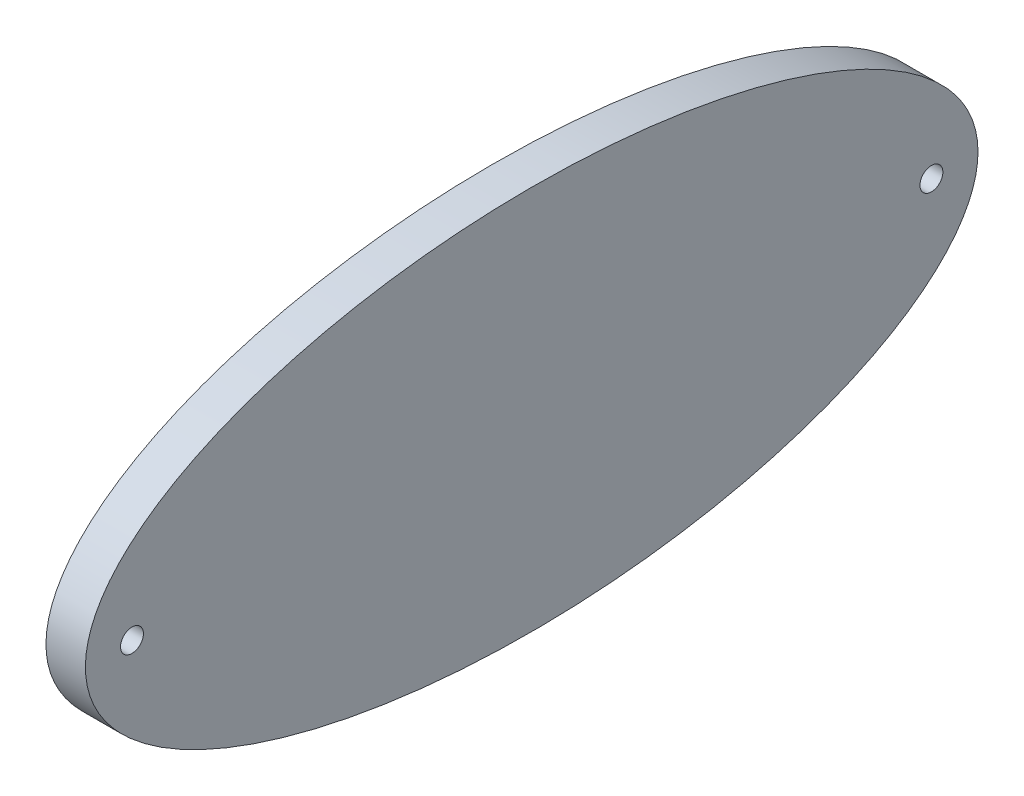
ISO-10303-21;
HEADER;
FILE_DESCRIPTION(('STEP AP214'),'2;1');
FILE_NAME('part.step','',(''),(''),'','','');
FILE_SCHEMA(('AUTOMOTIVE_DESIGN { 1 0 10303 214 1 1 1 1 }'));
ENDSEC;
DATA;
#1=APPLICATION_CONTEXT('core data for automotive mechanical design processes');
#2=APPLICATION_PROTOCOL_DEFINITION('international standard','automotive_design',2000,#1);
#3=PRODUCT_CONTEXT('',#1,'mechanical');
#4=PRODUCT('Part','Part','',(#3));
#5=PRODUCT_RELATED_PRODUCT_CATEGORY('part','',(#4));
#6=PRODUCT_DEFINITION_FORMATION('','',#4);
#7=PRODUCT_DEFINITION_CONTEXT('part definition',#1,'design');
#8=PRODUCT_DEFINITION('design','',#6,#7);
#9=PRODUCT_DEFINITION_SHAPE('','',#8);
#10=(LENGTH_UNIT() NAMED_UNIT(*) SI_UNIT(.MILLI.,.METRE.));
#11=(NAMED_UNIT(*) PLANE_ANGLE_UNIT() SI_UNIT($,.RADIAN.));
#12=(NAMED_UNIT(*) SI_UNIT($,.STERADIAN.) SOLID_ANGLE_UNIT());
#13=UNCERTAINTY_MEASURE_WITH_UNIT(LENGTH_MEASURE(1.E-05),#10,'distance_accuracy_value','');
#14=(GEOMETRIC_REPRESENTATION_CONTEXT(3) GLOBAL_UNCERTAINTY_ASSIGNED_CONTEXT((#13)) GLOBAL_UNIT_ASSIGNED_CONTEXT((#10,
#11,#12)) REPRESENTATION_CONTEXT('',''));
#15=CARTESIAN_POINT('',(0.,0.,0.));
#16=DIRECTION('',(0.,0.,1.));
#17=DIRECTION('',(1.,0.,0.));
#18=AXIS2_PLACEMENT_3D('',#15,#16,#17);
#19=CARTESIAN_POINT('',(5.08,0.,0.));
#20=DIRECTION('',(1.,0.,0.));
#21=DIRECTION('',(0.,0.,-1.));
#22=AXIS2_PLACEMENT_3D('',#19,#20,#21);
#23=PLANE('',#22);
#24=CARTESIAN_POINT('',(5.08,0.,51.5));
#25=DIRECTION('',(1.,0.,0.));
#26=DIRECTION('',(0.,0.,-1.));
#27=AXIS2_PLACEMENT_3D('',#24,#25,#26);
#28=CIRCLE('',#27,1.4732);
#29=CARTESIAN_POINT('',(5.08,0.,50.0268));
#30=VERTEX_POINT('',#29);
#31=EDGE_CURVE('E42',#30,#30,#28,.T.);
#32=ORIENTED_EDGE('',*,*,#31,.F.);
#33=EDGE_LOOP('',(#32));
#34=FACE_BOUND('',#33,.T.);
#35=CARTESIAN_POINT('',(5.08,0.,0.));
#36=DIRECTION('',(1.,0.,0.));
#37=DIRECTION('',(0.,0.,-1.));
#38=AXIS2_PLACEMENT_3D('',#35,#36,#37);
#39=ELLIPSE('',#38,57.5,24.8);
#40=CARTESIAN_POINT('',(5.08,0.,-57.5));
#41=VERTEX_POINT('',#40);
#42=EDGE_CURVE('E10',#41,#41,#39,.T.);
#43=ORIENTED_EDGE('',*,*,#42,.T.);
#44=EDGE_LOOP('',(#43));
#45=FACE_BOUND('',#44,.T.);
#46=CARTESIAN_POINT('',(5.08,0.,-51.5));
#47=DIRECTION('',(1.,0.,0.));
#48=DIRECTION('',(0.,0.,-1.));
#49=AXIS2_PLACEMENT_3D('',#46,#47,#48);
#50=CIRCLE('',#49,1.47320000000001);
#51=CARTESIAN_POINT('',(5.08,0.,-52.9732));
#52=VERTEX_POINT('',#51);
#53=EDGE_CURVE('E48',#52,#52,#50,.T.);
#54=ORIENTED_EDGE('',*,*,#53,.F.);
#55=EDGE_LOOP('',(#54));
#56=FACE_BOUND('',#55,.T.);
#57=ADVANCED_FACE('F31',(#34,#45,#56),#23,.T.);
#58=CARTESIAN_POINT('',(0.,0.,0.));
#59=DIRECTION('',(1.,0.,0.));
#60=DIRECTION('',(0.,0.,-1.));
#61=AXIS2_PLACEMENT_3D('',#58,#59,#60);
#62=PLANE('',#61);
#63=CARTESIAN_POINT('',(0.,0.,0.));
#64=DIRECTION('',(1.,0.,0.));
#65=DIRECTION('',(0.,0.,-1.));
#66=AXIS2_PLACEMENT_3D('',#63,#64,#65);
#67=ELLIPSE('',#66,57.5,24.8);
#68=CARTESIAN_POINT('',(0.,0.,-57.5));
#69=VERTEX_POINT('',#68);
#70=EDGE_CURVE('E36',#69,#69,#67,.T.);
#71=ORIENTED_EDGE('',*,*,#70,.F.);
#72=EDGE_LOOP('',(#71));
#73=FACE_BOUND('',#72,.T.);
#74=CARTESIAN_POINT('',(0.,0.,51.5));
#75=DIRECTION('',(1.,0.,0.));
#76=DIRECTION('',(0.,0.,-1.));
#77=AXIS2_PLACEMENT_3D('',#74,#75,#76);
#78=CIRCLE('',#77,1.4732);
#79=CARTESIAN_POINT('',(0.,0.,50.0268));
#80=VERTEX_POINT('',#79);
#81=EDGE_CURVE('E45',#80,#80,#78,.T.);
#82=ORIENTED_EDGE('',*,*,#81,.T.);
#83=EDGE_LOOP('',(#82));
#84=FACE_BOUND('',#83,.T.);
#85=CARTESIAN_POINT('',(0.,0.,-51.5));
#86=DIRECTION('',(1.,0.,0.));
#87=DIRECTION('',(0.,0.,-1.));
#88=AXIS2_PLACEMENT_3D('',#85,#86,#87);
#89=CIRCLE('',#88,1.47320000000001);
#90=CARTESIAN_POINT('',(0.,0.,-52.9732));
#91=VERTEX_POINT('',#90);
#92=EDGE_CURVE('E51',#91,#91,#89,.T.);
#93=ORIENTED_EDGE('',*,*,#92,.T.);
#94=EDGE_LOOP('',(#93));
#95=FACE_BOUND('',#94,.T.);
#96=ADVANCED_FACE('F61',(#73,#84,#95),#62,.F.);
#97=DIRECTION('',(-1.,0.,0.));
#98=VECTOR('',#97,1.);
#99=SURFACE_OF_LINEAR_EXTRUSION('',#39,#98);
#100=ORIENTED_EDGE('',*,*,#42,.F.);
#101=EDGE_LOOP('',(#100));
#102=FACE_BOUND('',#101,.T.);
#103=ORIENTED_EDGE('',*,*,#70,.T.);
#104=EDGE_LOOP('',(#103));
#105=FACE_BOUND('',#104,.T.);
#106=ADVANCED_FACE('F33',(#102,#105),#99,.F.);
#107=CARTESIAN_POINT('',(5.08,0.,51.5));
#108=DIRECTION('',(-1.,0.,0.));
#109=DIRECTION('',(0.,0.,1.));
#110=AXIS2_PLACEMENT_3D('',#107,#108,#109);
#111=CYLINDRICAL_SURFACE('',#110,1.4732);
#112=ORIENTED_EDGE('',*,*,#31,.T.);
#113=EDGE_LOOP('',(#112));
#114=FACE_BOUND('',#113,.T.);
#115=ORIENTED_EDGE('',*,*,#81,.F.);
#116=EDGE_LOOP('',(#115));
#117=FACE_BOUND('',#116,.T.);
#118=ADVANCED_FACE('F70',(#114,#117),#111,.F.);
#119=CARTESIAN_POINT('',(5.08,0.,-51.5));
#120=DIRECTION('',(-1.,0.,0.));
#121=DIRECTION('',(0.,0.,1.));
#122=AXIS2_PLACEMENT_3D('',#119,#120,#121);
#123=CYLINDRICAL_SURFACE('',#122,1.47320000000001);
#124=ORIENTED_EDGE('',*,*,#53,.T.);
#125=EDGE_LOOP('',(#124));
#126=FACE_BOUND('',#125,.T.);
#127=ORIENTED_EDGE('',*,*,#92,.F.);
#128=EDGE_LOOP('',(#127));
#129=FACE_BOUND('',#128,.T.);
#130=ADVANCED_FACE('F57',(#126,#129),#123,.F.);
#131=CLOSED_SHELL('',(#57,#96,#106,#118,#130));
#132=MANIFOLD_SOLID_BREP('B2',#131);
#133=ADVANCED_BREP_SHAPE_REPRESENTATION('',(#18,#132),#14);
#134=SHAPE_DEFINITION_REPRESENTATION(#9,#133);
ENDSEC;
END-ISO-10303-21;
